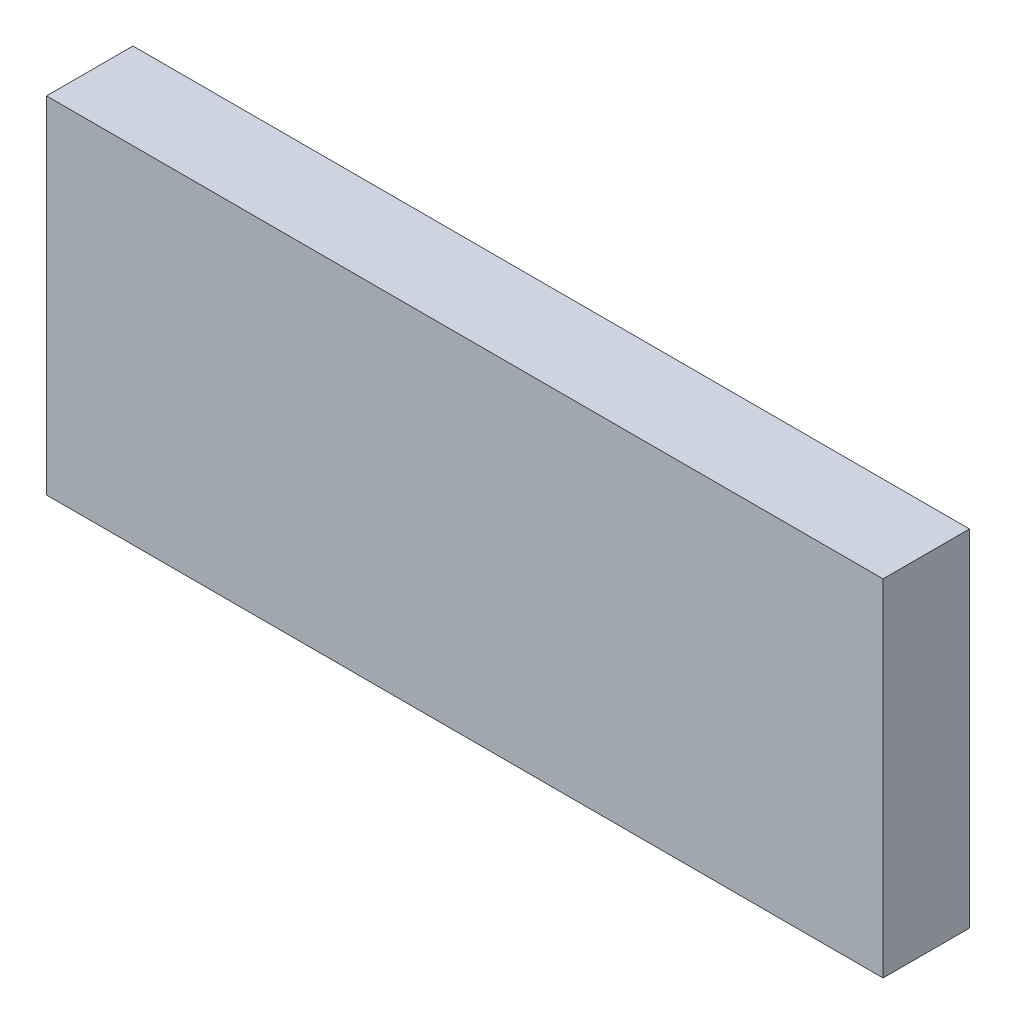
ISO-10303-21;
HEADER;
FILE_DESCRIPTION(('STEP AP214'),'2;1');
FILE_NAME('part.step','',(''),(''),'','','');
FILE_SCHEMA(('AUTOMOTIVE_DESIGN { 1 0 10303 214 1 1 1 1 }'));
ENDSEC;
DATA;
#1=APPLICATION_CONTEXT('core data for automotive mechanical design processes');
#2=APPLICATION_PROTOCOL_DEFINITION('international standard','automotive_design',2000,#1);
#3=PRODUCT_CONTEXT('',#1,'mechanical');
#4=PRODUCT('Part','Part','',(#3));
#5=PRODUCT_RELATED_PRODUCT_CATEGORY('part','',(#4));
#6=PRODUCT_DEFINITION_FORMATION('','',#4);
#7=PRODUCT_DEFINITION_CONTEXT('part definition',#1,'design');
#8=PRODUCT_DEFINITION('design','',#6,#7);
#9=PRODUCT_DEFINITION_SHAPE('','',#8);
#10=(LENGTH_UNIT() NAMED_UNIT(*) SI_UNIT(.MILLI.,.METRE.));
#11=(NAMED_UNIT(*) PLANE_ANGLE_UNIT() SI_UNIT($,.RADIAN.));
#12=(NAMED_UNIT(*) SI_UNIT($,.STERADIAN.) SOLID_ANGLE_UNIT());
#13=UNCERTAINTY_MEASURE_WITH_UNIT(LENGTH_MEASURE(1.E-05),#10,'distance_accuracy_value','');
#14=(GEOMETRIC_REPRESENTATION_CONTEXT(3) GLOBAL_UNCERTAINTY_ASSIGNED_CONTEXT((#13)) GLOBAL_UNIT_ASSIGNED_CONTEXT((#10,
#11,#12)) REPRESENTATION_CONTEXT('',''));
#15=CARTESIAN_POINT('',(0.,0.,0.));
#16=DIRECTION('',(0.,0.,1.));
#17=DIRECTION('',(1.,0.,0.));
#18=AXIS2_PLACEMENT_3D('',#15,#16,#17);
#19=CARTESIAN_POINT('',(48.4024656478745,-20.,10.));
#20=DIRECTION('',(-1.,0.,0.));
#21=DIRECTION('',(0.,0.,1.));
#22=AXIS2_PLACEMENT_3D('',#19,#20,#21);
#23=PLANE('',#22);
#24=DIRECTION('',(0.,1.,0.));
#25=VECTOR('',#24,1.);
#26=CARTESIAN_POINT('',(48.4024656478745,-20.,0.));
#27=LINE('',#26,#25);
#28=CARTESIAN_POINT('',(48.4024656478745,-20.,0.));
#29=VERTEX_POINT('',#28);
#30=CARTESIAN_POINT('',(48.4024656478745,20.,0.));
#31=VERTEX_POINT('',#30);
#32=EDGE_CURVE('E128',#29,#31,#27,.T.);
#33=ORIENTED_EDGE('',*,*,#32,.T.);
#34=DIRECTION('',(0.,0.,-1.));
#35=VECTOR('',#34,1.);
#36=CARTESIAN_POINT('',(48.4024656478745,20.,10.));
#37=LINE('',#36,#35);
#38=CARTESIAN_POINT('',(48.4024656478745,20.,10.));
#39=VERTEX_POINT('',#38);
#40=EDGE_CURVE('E12',#39,#31,#37,.T.);
#41=ORIENTED_EDGE('',*,*,#40,.F.);
#42=DIRECTION('',(0.,1.,0.));
#43=VECTOR('',#42,1.);
#44=CARTESIAN_POINT('',(48.4024656478745,-20.,10.));
#45=LINE('',#44,#43);
#46=CARTESIAN_POINT('',(48.4024656478745,-20.,10.));
#47=VERTEX_POINT('',#46);
#48=EDGE_CURVE('E92',#47,#39,#45,.T.);
#49=ORIENTED_EDGE('',*,*,#48,.F.);
#50=DIRECTION('',(0.,0.,-1.));
#51=VECTOR('',#50,1.);
#52=CARTESIAN_POINT('',(48.4024656478745,-20.,10.));
#53=LINE('',#52,#51);
#54=EDGE_CURVE('E104',#47,#29,#53,.T.);
#55=ORIENTED_EDGE('',*,*,#54,.T.);
#56=EDGE_LOOP('',(#33,#41,#49,#55));
#57=FACE_BOUND('',#56,.T.);
#58=ADVANCED_FACE('F40',(#57),#23,.F.);
#59=CARTESIAN_POINT('',(-48.4024656478745,20.,10.));
#60=DIRECTION('',(0.,-1.,0.));
#61=DIRECTION('',(0.,0.,-1.));
#62=AXIS2_PLACEMENT_3D('',#59,#60,#61);
#63=PLANE('',#62);
#64=DIRECTION('',(-1.,0.,0.));
#65=VECTOR('',#64,1.);
#66=CARTESIAN_POINT('',(-48.4024656478745,20.,0.));
#67=LINE('',#66,#65);
#68=CARTESIAN_POINT('',(-48.4024656478745,20.,0.));
#69=VERTEX_POINT('',#68);
#70=EDGE_CURVE('E97',#31,#69,#67,.T.);
#71=ORIENTED_EDGE('',*,*,#70,.T.);
#72=DIRECTION('',(0.,0.,-1.));
#73=VECTOR('',#72,1.);
#74=CARTESIAN_POINT('',(-48.4024656478745,20.,10.));
#75=LINE('',#74,#73);
#76=CARTESIAN_POINT('',(-48.4024656478745,20.,10.));
#77=VERTEX_POINT('',#76);
#78=EDGE_CURVE('E49',#77,#69,#75,.T.);
#79=ORIENTED_EDGE('',*,*,#78,.F.);
#80=DIRECTION('',(-1.,0.,0.));
#81=VECTOR('',#80,1.);
#82=CARTESIAN_POINT('',(-48.4024656478745,20.,10.));
#83=LINE('',#82,#81);
#84=EDGE_CURVE('E87',#39,#77,#83,.T.);
#85=ORIENTED_EDGE('',*,*,#84,.F.);
#86=ORIENTED_EDGE('',*,*,#40,.T.);
#87=EDGE_LOOP('',(#71,#79,#85,#86));
#88=FACE_BOUND('',#87,.T.);
#89=ADVANCED_FACE('F96',(#88),#63,.F.);
#90=CARTESIAN_POINT('',(-48.4024656478745,-20.,10.));
#91=DIRECTION('',(1.,0.,0.));
#92=DIRECTION('',(0.,0.,-1.));
#93=AXIS2_PLACEMENT_3D('',#90,#91,#92);
#94=PLANE('',#93);
#95=DIRECTION('',(0.,-1.,0.));
#96=VECTOR('',#95,1.);
#97=CARTESIAN_POINT('',(-48.4024656478745,-20.,0.));
#98=LINE('',#97,#96);
#99=CARTESIAN_POINT('',(-48.4024656478745,-20.,0.));
#100=VERTEX_POINT('',#99);
#101=EDGE_CURVE('E74',#69,#100,#98,.T.);
#102=ORIENTED_EDGE('',*,*,#101,.T.);
#103=DIRECTION('',(0.,0.,-1.));
#104=VECTOR('',#103,1.);
#105=CARTESIAN_POINT('',(-48.4024656478745,-20.,10.));
#106=LINE('',#105,#104);
#107=CARTESIAN_POINT('',(-48.4024656478745,-20.,10.));
#108=VERTEX_POINT('',#107);
#109=EDGE_CURVE('E99',#108,#100,#106,.T.);
#110=ORIENTED_EDGE('',*,*,#109,.F.);
#111=DIRECTION('',(0.,-1.,0.));
#112=VECTOR('',#111,1.);
#113=CARTESIAN_POINT('',(-48.4024656478745,-20.,10.));
#114=LINE('',#113,#112);
#115=EDGE_CURVE('E90',#77,#108,#114,.T.);
#116=ORIENTED_EDGE('',*,*,#115,.F.);
#117=ORIENTED_EDGE('',*,*,#78,.T.);
#118=EDGE_LOOP('',(#102,#110,#116,#117));
#119=FACE_BOUND('',#118,.T.);
#120=ADVANCED_FACE('F100',(#119),#94,.F.);
#121=CARTESIAN_POINT('',(-48.4024656478745,-20.,10.));
#122=DIRECTION('',(0.,1.,0.));
#123=DIRECTION('',(0.,0.,1.));
#124=AXIS2_PLACEMENT_3D('',#121,#122,#123);
#125=PLANE('',#124);
#126=DIRECTION('',(1.,0.,0.));
#127=VECTOR('',#126,1.);
#128=CARTESIAN_POINT('',(-48.4024656478745,-20.,0.));
#129=LINE('',#128,#127);
#130=EDGE_CURVE('E80',#100,#29,#129,.T.);
#131=ORIENTED_EDGE('',*,*,#130,.T.);
#132=ORIENTED_EDGE('',*,*,#54,.F.);
#133=DIRECTION('',(1.,0.,0.));
#134=VECTOR('',#133,1.);
#135=CARTESIAN_POINT('',(-48.4024656478745,-20.,10.));
#136=LINE('',#135,#134);
#137=EDGE_CURVE('E57',#108,#47,#136,.T.);
#138=ORIENTED_EDGE('',*,*,#137,.F.);
#139=ORIENTED_EDGE('',*,*,#109,.T.);
#140=EDGE_LOOP('',(#131,#132,#138,#139));
#141=FACE_BOUND('',#140,.T.);
#142=ADVANCED_FACE('F123',(#141),#125,.F.);
#143=CARTESIAN_POINT('',(0.,0.,10.));
#144=DIRECTION('',(0.,0.,-1.));
#145=DIRECTION('',(-1.,0.,0.));
#146=AXIS2_PLACEMENT_3D('',#143,#144,#145);
#147=PLANE('',#146);
#148=ORIENTED_EDGE('',*,*,#48,.T.);
#149=ORIENTED_EDGE('',*,*,#84,.T.);
#150=ORIENTED_EDGE('',*,*,#115,.T.);
#151=ORIENTED_EDGE('',*,*,#137,.T.);
#152=EDGE_LOOP('',(#148,#149,#150,#151));
#153=FACE_BOUND('',#152,.T.);
#154=ADVANCED_FACE('F88',(#153),#147,.F.);
#155=CARTESIAN_POINT('',(0.,0.,0.));
#156=DIRECTION('',(0.,0.,-1.));
#157=DIRECTION('',(-1.,0.,0.));
#158=AXIS2_PLACEMENT_3D('',#155,#156,#157);
#159=PLANE('',#158);
#160=ORIENTED_EDGE('',*,*,#32,.F.);
#161=ORIENTED_EDGE('',*,*,#130,.F.);
#162=ORIENTED_EDGE('',*,*,#101,.F.);
#163=ORIENTED_EDGE('',*,*,#70,.F.);
#164=EDGE_LOOP('',(#160,#161,#162,#163));
#165=FACE_BOUND('',#164,.T.);
#166=ADVANCED_FACE('F126',(#165),#159,.T.);
#167=CLOSED_SHELL('',(#58,#89,#120,#142,#154,#166));
#168=MANIFOLD_SOLID_BREP('B2',#167);
#169=ADVANCED_BREP_SHAPE_REPRESENTATION('',(#18,#168),#14);
#170=SHAPE_DEFINITION_REPRESENTATION(#9,#169);
ENDSEC;
END-ISO-10303-21;
